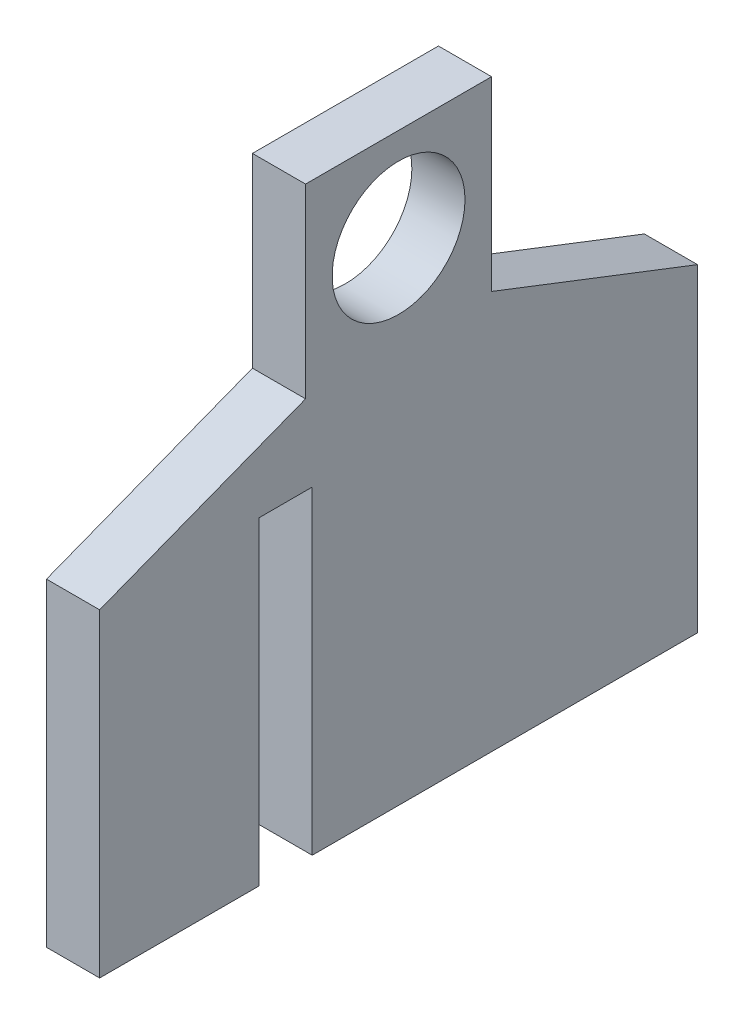
ISO-10303-21;
HEADER;
FILE_DESCRIPTION(('STEP AP214'),'2;1');
FILE_NAME('part.step','',(''),(''),'','','');
FILE_SCHEMA(('AUTOMOTIVE_DESIGN { 1 0 10303 214 1 1 1 1 }'));
ENDSEC;
DATA;
#1=APPLICATION_CONTEXT('core data for automotive mechanical design processes');
#2=APPLICATION_PROTOCOL_DEFINITION('international standard','automotive_design',2000,#1);
#3=PRODUCT_CONTEXT('',#1,'mechanical');
#4=PRODUCT('Part','Part','',(#3));
#5=PRODUCT_RELATED_PRODUCT_CATEGORY('part','',(#4));
#6=PRODUCT_DEFINITION_FORMATION('','',#4);
#7=PRODUCT_DEFINITION_CONTEXT('part definition',#1,'design');
#8=PRODUCT_DEFINITION('design','',#6,#7);
#9=PRODUCT_DEFINITION_SHAPE('','',#8);
#10=(LENGTH_UNIT() NAMED_UNIT(*) SI_UNIT(.MILLI.,.METRE.));
#11=(NAMED_UNIT(*) PLANE_ANGLE_UNIT() SI_UNIT($,.RADIAN.));
#12=(NAMED_UNIT(*) SI_UNIT($,.STERADIAN.) SOLID_ANGLE_UNIT());
#13=UNCERTAINTY_MEASURE_WITH_UNIT(LENGTH_MEASURE(1.E-05),#10,'distance_accuracy_value','');
#14=(GEOMETRIC_REPRESENTATION_CONTEXT(3) GLOBAL_UNCERTAINTY_ASSIGNED_CONTEXT((#13)) GLOBAL_UNIT_ASSIGNED_CONTEXT((#10,
#11,#12)) REPRESENTATION_CONTEXT('',''));
#15=CARTESIAN_POINT('',(0.,0.,0.));
#16=DIRECTION('',(0.,0.,1.));
#17=DIRECTION('',(1.,0.,0.));
#18=AXIS2_PLACEMENT_3D('',#15,#16,#17);
#19=CARTESIAN_POINT('',(2.,0.,0.));
#20=DIRECTION('',(1.,0.,0.));
#21=DIRECTION('',(0.,0.,-1.));
#22=AXIS2_PLACEMENT_3D('',#19,#20,#21);
#23=PLANE('',#22);
#24=DIRECTION('',(0.,-1.,0.));
#25=VECTOR('',#24,1.);
#26=CARTESIAN_POINT('',(2.,12.,11.25));
#27=LINE('',#26,#25);
#28=CARTESIAN_POINT('',(2.,12.,11.25));
#29=VERTEX_POINT('',#28);
#30=CARTESIAN_POINT('',(2.,0.,11.25));
#31=VERTEX_POINT('',#30);
#32=EDGE_CURVE('E177',#29,#31,#27,.T.);
#33=ORIENTED_EDGE('',*,*,#32,.T.);
#34=DIRECTION('',(0.,0.,-1.));
#35=VECTOR('',#34,1.);
#36=CARTESIAN_POINT('',(2.,0.,11.25));
#37=LINE('',#36,#35);
#38=CARTESIAN_POINT('',(2.,0.,5.25));
#39=VERTEX_POINT('',#38);
#40=EDGE_CURVE('E105',#31,#39,#37,.T.);
#41=ORIENTED_EDGE('',*,*,#40,.T.);
#42=DIRECTION('',(0.,1.,0.));
#43=VECTOR('',#42,1.);
#44=CARTESIAN_POINT('',(2.,0.,5.25));
#45=LINE('',#44,#43);
#46=CARTESIAN_POINT('',(2.,12.,5.25));
#47=VERTEX_POINT('',#46);
#48=EDGE_CURVE('E204',#39,#47,#45,.T.);
#49=ORIENTED_EDGE('',*,*,#48,.T.);
#50=DIRECTION('',(0.,0.,-1.));
#51=VECTOR('',#50,1.);
#52=CARTESIAN_POINT('',(2.,12.,5.25));
#53=LINE('',#52,#51);
#54=CARTESIAN_POINT('',(2.,12.,3.25));
#55=VERTEX_POINT('',#54);
#56=EDGE_CURVE('E223',#47,#55,#53,.T.);
#57=ORIENTED_EDGE('',*,*,#56,.T.);
#58=DIRECTION('',(0.,-1.,0.));
#59=VECTOR('',#58,1.);
#60=CARTESIAN_POINT('',(2.,12.,3.25));
#61=LINE('',#60,#59);
#62=CARTESIAN_POINT('',(2.,0.,3.25));
#63=VERTEX_POINT('',#62);
#64=EDGE_CURVE('E220',#55,#63,#61,.T.);
#65=ORIENTED_EDGE('',*,*,#64,.T.);
#66=DIRECTION('',(0.,0.,-1.));
#67=VECTOR('',#66,1.);
#68=CARTESIAN_POINT('',(2.,0.,3.25));
#69=LINE('',#68,#67);
#70=CARTESIAN_POINT('',(2.,0.,-11.25));
#71=VERTEX_POINT('',#70);
#72=EDGE_CURVE('E222',#63,#71,#69,.T.);
#73=ORIENTED_EDGE('',*,*,#72,.T.);
#74=DIRECTION('',(0.,1.,0.));
#75=VECTOR('',#74,1.);
#76=CARTESIAN_POINT('',(2.,0.,-11.25));
#77=LINE('',#76,#75);
#78=CARTESIAN_POINT('',(2.,12.,-11.25));
#79=VERTEX_POINT('',#78);
#80=EDGE_CURVE('E225',#71,#79,#77,.T.);
#81=ORIENTED_EDGE('',*,*,#80,.T.);
#82=DIRECTION('',(0.,0.360994102557712,0.93256809827409));
#83=VECTOR('',#82,1.);
#84=CARTESIAN_POINT('',(2.,12.,-11.25));
#85=LINE('',#84,#83);
#86=CARTESIAN_POINT('',(2.,15.,-3.5));
#87=VERTEX_POINT('',#86);
#88=EDGE_CURVE('E231',#79,#87,#85,.T.);
#89=ORIENTED_EDGE('',*,*,#88,.T.);
#90=DIRECTION('',(0.,1.,0.));
#91=VECTOR('',#90,1.);
#92=CARTESIAN_POINT('',(2.,15.,-3.5));
#93=LINE('',#92,#91);
#94=CARTESIAN_POINT('',(2.,22.,-3.5));
#95=VERTEX_POINT('',#94);
#96=EDGE_CURVE('E136',#87,#95,#93,.T.);
#97=ORIENTED_EDGE('',*,*,#96,.T.);
#98=DIRECTION('',(0.,0.,1.));
#99=VECTOR('',#98,1.);
#100=CARTESIAN_POINT('',(2.,22.,-3.5));
#101=LINE('',#100,#99);
#102=CARTESIAN_POINT('',(2.,22.,3.5));
#103=VERTEX_POINT('',#102);
#104=EDGE_CURVE('E130',#95,#103,#101,.T.);
#105=ORIENTED_EDGE('',*,*,#104,.T.);
#106=DIRECTION('',(0.,-1.,0.));
#107=VECTOR('',#106,1.);
#108=CARTESIAN_POINT('',(2.,22.,3.5));
#109=LINE('',#108,#107);
#110=CARTESIAN_POINT('',(2.,15.,3.5));
#111=VERTEX_POINT('',#110);
#112=EDGE_CURVE('E134',#103,#111,#109,.T.);
#113=ORIENTED_EDGE('',*,*,#112,.T.);
#114=DIRECTION('',(0.,-0.360994102557712,0.93256809827409));
#115=VECTOR('',#114,1.);
#116=CARTESIAN_POINT('',(2.,15.,3.5));
#117=LINE('',#116,#115);
#118=EDGE_CURVE('E50',#111,#29,#117,.T.);
#119=ORIENTED_EDGE('',*,*,#118,.T.);
#120=EDGE_LOOP('',(#33,#41,#49,#57,#65,#73,#81,#89,#97,#105,#113,#119));
#121=FACE_BOUND('',#120,.T.);
#122=CARTESIAN_POINT('',(2.,18.5,0.));
#123=DIRECTION('',(1.,0.,0.));
#124=DIRECTION('',(0.,0.,-1.));
#125=AXIS2_PLACEMENT_3D('',#122,#123,#124);
#126=CIRCLE('',#125,2.5);
#127=CARTESIAN_POINT('',(2.,18.5,-2.5));
#128=VERTEX_POINT('',#127);
#129=EDGE_CURVE('E158',#128,#128,#126,.T.);
#130=ORIENTED_EDGE('',*,*,#129,.F.);
#131=EDGE_LOOP('',(#130));
#132=FACE_BOUND('',#131,.T.);
#133=ADVANCED_FACE('F33',(#121,#132),#23,.T.);
#134=CARTESIAN_POINT('',(0.,0.,0.));
#135=DIRECTION('',(1.,0.,0.));
#136=DIRECTION('',(0.,0.,-1.));
#137=AXIS2_PLACEMENT_3D('',#134,#135,#136);
#138=PLANE('',#137);
#139=DIRECTION('',(0.,-1.,0.));
#140=VECTOR('',#139,1.);
#141=CARTESIAN_POINT('',(0.,12.,11.25));
#142=LINE('',#141,#140);
#143=CARTESIAN_POINT('',(0.,12.,11.25));
#144=VERTEX_POINT('',#143);
#145=CARTESIAN_POINT('',(0.,0.,11.25));
#146=VERTEX_POINT('',#145);
#147=EDGE_CURVE('E154',#144,#146,#142,.T.);
#148=ORIENTED_EDGE('',*,*,#147,.F.);
#149=DIRECTION('',(0.,-0.360994102557712,0.93256809827409));
#150=VECTOR('',#149,1.);
#151=CARTESIAN_POINT('',(0.,15.,3.5));
#152=LINE('',#151,#150);
#153=CARTESIAN_POINT('',(0.,15.,3.5));
#154=VERTEX_POINT('',#153);
#155=EDGE_CURVE('E97',#154,#144,#152,.T.);
#156=ORIENTED_EDGE('',*,*,#155,.F.);
#157=DIRECTION('',(0.,-1.,0.));
#158=VECTOR('',#157,1.);
#159=CARTESIAN_POINT('',(0.,22.,3.5));
#160=LINE('',#159,#158);
#161=CARTESIAN_POINT('',(0.,22.,3.5));
#162=VERTEX_POINT('',#161);
#163=EDGE_CURVE('E91',#162,#154,#160,.T.);
#164=ORIENTED_EDGE('',*,*,#163,.F.);
#165=DIRECTION('',(0.,0.,1.));
#166=VECTOR('',#165,1.);
#167=CARTESIAN_POINT('',(0.,22.,-3.5));
#168=LINE('',#167,#166);
#169=CARTESIAN_POINT('',(0.,22.,-3.5));
#170=VERTEX_POINT('',#169);
#171=EDGE_CURVE('E144',#170,#162,#168,.T.);
#172=ORIENTED_EDGE('',*,*,#171,.F.);
#173=DIRECTION('',(0.,1.,0.));
#174=VECTOR('',#173,1.);
#175=CARTESIAN_POINT('',(0.,15.,-3.5));
#176=LINE('',#175,#174);
#177=CARTESIAN_POINT('',(0.,15.,-3.5));
#178=VERTEX_POINT('',#177);
#179=EDGE_CURVE('E172',#178,#170,#176,.T.);
#180=ORIENTED_EDGE('',*,*,#179,.F.);
#181=DIRECTION('',(0.,0.360994102557712,0.93256809827409));
#182=VECTOR('',#181,1.);
#183=CARTESIAN_POINT('',(0.,12.,-11.25));
#184=LINE('',#183,#182);
#185=CARTESIAN_POINT('',(0.,12.,-11.25));
#186=VERTEX_POINT('',#185);
#187=EDGE_CURVE('E170',#186,#178,#184,.T.);
#188=ORIENTED_EDGE('',*,*,#187,.F.);
#189=DIRECTION('',(0.,1.,0.));
#190=VECTOR('',#189,1.);
#191=CARTESIAN_POINT('',(0.,0.,-11.25));
#192=LINE('',#191,#190);
#193=CARTESIAN_POINT('',(0.,0.,-11.25));
#194=VERTEX_POINT('',#193);
#195=EDGE_CURVE('E168',#194,#186,#192,.T.);
#196=ORIENTED_EDGE('',*,*,#195,.F.);
#197=DIRECTION('',(0.,0.,-1.));
#198=VECTOR('',#197,1.);
#199=CARTESIAN_POINT('',(0.,0.,3.25));
#200=LINE('',#199,#198);
#201=CARTESIAN_POINT('',(0.,0.,3.25));
#202=VERTEX_POINT('',#201);
#203=EDGE_CURVE('E166',#202,#194,#200,.T.);
#204=ORIENTED_EDGE('',*,*,#203,.F.);
#205=DIRECTION('',(0.,-1.,0.));
#206=VECTOR('',#205,1.);
#207=CARTESIAN_POINT('',(0.,12.,3.25));
#208=LINE('',#207,#206);
#209=CARTESIAN_POINT('',(0.,12.,3.25));
#210=VERTEX_POINT('',#209);
#211=EDGE_CURVE('E164',#210,#202,#208,.T.);
#212=ORIENTED_EDGE('',*,*,#211,.F.);
#213=DIRECTION('',(0.,0.,-1.));
#214=VECTOR('',#213,1.);
#215=CARTESIAN_POINT('',(0.,12.,5.25));
#216=LINE('',#215,#214);
#217=CARTESIAN_POINT('',(0.,12.,5.25));
#218=VERTEX_POINT('',#217);
#219=EDGE_CURVE('E162',#218,#210,#216,.T.);
#220=ORIENTED_EDGE('',*,*,#219,.F.);
#221=DIRECTION('',(0.,1.,0.));
#222=VECTOR('',#221,1.);
#223=CARTESIAN_POINT('',(0.,0.,5.25));
#224=LINE('',#223,#222);
#225=CARTESIAN_POINT('',(0.,0.,5.25));
#226=VERTEX_POINT('',#225);
#227=EDGE_CURVE('E160',#226,#218,#224,.T.);
#228=ORIENTED_EDGE('',*,*,#227,.F.);
#229=DIRECTION('',(0.,0.,-1.));
#230=VECTOR('',#229,1.);
#231=CARTESIAN_POINT('',(0.,0.,11.25));
#232=LINE('',#231,#230);
#233=EDGE_CURVE('E157',#146,#226,#232,.T.);
#234=ORIENTED_EDGE('',*,*,#233,.F.);
#235=EDGE_LOOP('',(#148,#156,#164,#172,#180,#188,#196,#204,#212,#220,#228,#234));
#236=FACE_BOUND('',#235,.T.);
#237=CARTESIAN_POINT('',(0.,18.5,0.));
#238=DIRECTION('',(1.,0.,0.));
#239=DIRECTION('',(0.,0.,-1.));
#240=AXIS2_PLACEMENT_3D('',#237,#238,#239);
#241=CIRCLE('',#240,2.5);
#242=CARTESIAN_POINT('',(0.,18.5,-2.5));
#243=VERTEX_POINT('',#242);
#244=EDGE_CURVE('E378',#243,#243,#241,.T.);
#245=ORIENTED_EDGE('',*,*,#244,.T.);
#246=EDGE_LOOP('',(#245));
#247=FACE_BOUND('',#246,.T.);
#248=ADVANCED_FACE('F208',(#236,#247),#138,.F.);
#249=CARTESIAN_POINT('',(2.,12.,11.25));
#250=DIRECTION('',(0.,0.,-1.));
#251=DIRECTION('',(0.,1.,0.));
#252=AXIS2_PLACEMENT_3D('',#249,#250,#251);
#253=PLANE('',#252);
#254=ORIENTED_EDGE('',*,*,#147,.T.);
#255=DIRECTION('',(-1.,0.,0.));
#256=VECTOR('',#255,1.);
#257=CARTESIAN_POINT('',(2.,0.,11.25));
#258=LINE('',#257,#256);
#259=EDGE_CURVE('E11',#31,#146,#258,.T.);
#260=ORIENTED_EDGE('',*,*,#259,.F.);
#261=ORIENTED_EDGE('',*,*,#32,.F.);
#262=DIRECTION('',(-1.,0.,0.));
#263=VECTOR('',#262,1.);
#264=CARTESIAN_POINT('',(2.,12.,11.25));
#265=LINE('',#264,#263);
#266=EDGE_CURVE('E150',#29,#144,#265,.T.);
#267=ORIENTED_EDGE('',*,*,#266,.T.);
#268=EDGE_LOOP('',(#254,#260,#261,#267));
#269=FACE_BOUND('',#268,.T.);
#270=ADVANCED_FACE('F35',(#269),#253,.F.);
#271=CARTESIAN_POINT('',(2.,0.,11.25));
#272=DIRECTION('',(0.,1.,0.));
#273=DIRECTION('',(0.,0.,1.));
#274=AXIS2_PLACEMENT_3D('',#271,#272,#273);
#275=PLANE('',#274);
#276=ORIENTED_EDGE('',*,*,#233,.T.);
#277=DIRECTION('',(-1.,0.,0.));
#278=VECTOR('',#277,1.);
#279=CARTESIAN_POINT('',(2.,0.,5.25));
#280=LINE('',#279,#278);
#281=EDGE_CURVE('E42',#39,#226,#280,.T.);
#282=ORIENTED_EDGE('',*,*,#281,.F.);
#283=ORIENTED_EDGE('',*,*,#40,.F.);
#284=ORIENTED_EDGE('',*,*,#259,.T.);
#285=EDGE_LOOP('',(#276,#282,#283,#284));
#286=FACE_BOUND('',#285,.T.);
#287=ADVANCED_FACE('F265',(#286),#275,.F.);
#288=CARTESIAN_POINT('',(2.,0.,5.25));
#289=DIRECTION('',(0.,0.,1.));
#290=DIRECTION('',(1.,0.,0.));
#291=AXIS2_PLACEMENT_3D('',#288,#289,#290);
#292=PLANE('',#291);
#293=ORIENTED_EDGE('',*,*,#227,.T.);
#294=DIRECTION('',(-1.,0.,0.));
#295=VECTOR('',#294,1.);
#296=CARTESIAN_POINT('',(2.,12.,5.25));
#297=LINE('',#296,#295);
#298=EDGE_CURVE('E196',#47,#218,#297,.T.);
#299=ORIENTED_EDGE('',*,*,#298,.F.);
#300=ORIENTED_EDGE('',*,*,#48,.F.);
#301=ORIENTED_EDGE('',*,*,#281,.T.);
#302=EDGE_LOOP('',(#293,#299,#300,#301));
#303=FACE_BOUND('',#302,.T.);
#304=ADVANCED_FACE('F202',(#303),#292,.F.);
#305=CARTESIAN_POINT('',(2.,12.,5.25));
#306=DIRECTION('',(0.,1.,0.));
#307=DIRECTION('',(0.,0.,1.));
#308=AXIS2_PLACEMENT_3D('',#305,#306,#307);
#309=PLANE('',#308);
#310=ORIENTED_EDGE('',*,*,#219,.T.);
#311=DIRECTION('',(-1.,0.,0.));
#312=VECTOR('',#311,1.);
#313=CARTESIAN_POINT('',(2.,12.,3.25));
#314=LINE('',#313,#312);
#315=EDGE_CURVE('E193',#55,#210,#314,.T.);
#316=ORIENTED_EDGE('',*,*,#315,.F.);
#317=ORIENTED_EDGE('',*,*,#56,.F.);
#318=ORIENTED_EDGE('',*,*,#298,.T.);
#319=EDGE_LOOP('',(#310,#316,#317,#318));
#320=FACE_BOUND('',#319,.T.);
#321=ADVANCED_FACE('F214',(#320),#309,.F.);
#322=CARTESIAN_POINT('',(2.,12.,3.25));
#323=DIRECTION('',(0.,0.,-1.));
#324=DIRECTION('',(0.,1.,0.));
#325=AXIS2_PLACEMENT_3D('',#322,#323,#324);
#326=PLANE('',#325);
#327=ORIENTED_EDGE('',*,*,#211,.T.);
#328=DIRECTION('',(-1.,0.,0.));
#329=VECTOR('',#328,1.);
#330=CARTESIAN_POINT('',(2.,0.,3.25));
#331=LINE('',#330,#329);
#332=EDGE_CURVE('E190',#63,#202,#331,.T.);
#333=ORIENTED_EDGE('',*,*,#332,.F.);
#334=ORIENTED_EDGE('',*,*,#64,.F.);
#335=ORIENTED_EDGE('',*,*,#315,.T.);
#336=EDGE_LOOP('',(#327,#333,#334,#335));
#337=FACE_BOUND('',#336,.T.);
#338=ADVANCED_FACE('F218',(#337),#326,.F.);
#339=CARTESIAN_POINT('',(2.,0.,3.25));
#340=DIRECTION('',(0.,1.,0.));
#341=DIRECTION('',(0.,0.,1.));
#342=AXIS2_PLACEMENT_3D('',#339,#340,#341);
#343=PLANE('',#342);
#344=ORIENTED_EDGE('',*,*,#203,.T.);
#345=DIRECTION('',(-1.,0.,0.));
#346=VECTOR('',#345,1.);
#347=CARTESIAN_POINT('',(2.,0.,-11.25));
#348=LINE('',#347,#346);
#349=EDGE_CURVE('E187',#71,#194,#348,.T.);
#350=ORIENTED_EDGE('',*,*,#349,.F.);
#351=ORIENTED_EDGE('',*,*,#72,.F.);
#352=ORIENTED_EDGE('',*,*,#332,.T.);
#353=EDGE_LOOP('',(#344,#350,#351,#352));
#354=FACE_BOUND('',#353,.T.);
#355=ADVANCED_FACE('F278',(#354),#343,.F.);
#356=CARTESIAN_POINT('',(2.,0.,-11.25));
#357=DIRECTION('',(0.,0.,1.));
#358=DIRECTION('',(0.,-1.,0.));
#359=AXIS2_PLACEMENT_3D('',#356,#357,#358);
#360=PLANE('',#359);
#361=ORIENTED_EDGE('',*,*,#195,.T.);
#362=DIRECTION('',(-1.,0.,0.));
#363=VECTOR('',#362,1.);
#364=CARTESIAN_POINT('',(2.,12.,-11.25));
#365=LINE('',#364,#363);
#366=EDGE_CURVE('E184',#79,#186,#365,.T.);
#367=ORIENTED_EDGE('',*,*,#366,.F.);
#368=ORIENTED_EDGE('',*,*,#80,.F.);
#369=ORIENTED_EDGE('',*,*,#349,.T.);
#370=EDGE_LOOP('',(#361,#367,#368,#369));
#371=FACE_BOUND('',#370,.T.);
#372=ADVANCED_FACE('F281',(#371),#360,.F.);
#373=CARTESIAN_POINT('',(2.,12.,-11.25));
#374=DIRECTION('',(0.,-0.93256809827409,0.360994102557712));
#375=DIRECTION('',(0.,-0.360994102557712,-0.93256809827409));
#376=AXIS2_PLACEMENT_3D('',#373,#374,#375);
#377=PLANE('',#376);
#378=ORIENTED_EDGE('',*,*,#187,.T.);
#379=DIRECTION('',(-1.,0.,0.));
#380=VECTOR('',#379,1.);
#381=CARTESIAN_POINT('',(2.,15.,-3.5));
#382=LINE('',#381,#380);
#383=EDGE_CURVE('E181',#87,#178,#382,.T.);
#384=ORIENTED_EDGE('',*,*,#383,.F.);
#385=ORIENTED_EDGE('',*,*,#88,.F.);
#386=ORIENTED_EDGE('',*,*,#366,.T.);
#387=EDGE_LOOP('',(#378,#384,#385,#386));
#388=FACE_BOUND('',#387,.T.);
#389=ADVANCED_FACE('F237',(#388),#377,.F.);
#390=CARTESIAN_POINT('',(2.,15.,-3.5));
#391=DIRECTION('',(0.,0.,1.));
#392=DIRECTION('',(0.,-1.,0.));
#393=AXIS2_PLACEMENT_3D('',#390,#391,#392);
#394=PLANE('',#393);
#395=ORIENTED_EDGE('',*,*,#179,.T.);
#396=DIRECTION('',(-1.,0.,0.));
#397=VECTOR('',#396,1.);
#398=CARTESIAN_POINT('',(2.,22.,-3.5));
#399=LINE('',#398,#397);
#400=EDGE_CURVE('E145',#95,#170,#399,.T.);
#401=ORIENTED_EDGE('',*,*,#400,.F.);
#402=ORIENTED_EDGE('',*,*,#96,.F.);
#403=ORIENTED_EDGE('',*,*,#383,.T.);
#404=EDGE_LOOP('',(#395,#401,#402,#403));
#405=FACE_BOUND('',#404,.T.);
#406=ADVANCED_FACE('F241',(#405),#394,.F.);
#407=CARTESIAN_POINT('',(2.,22.,-3.5));
#408=DIRECTION('',(0.,-1.,0.));
#409=DIRECTION('',(0.,0.,-1.));
#410=AXIS2_PLACEMENT_3D('',#407,#408,#409);
#411=PLANE('',#410);
#412=ORIENTED_EDGE('',*,*,#171,.T.);
#413=DIRECTION('',(-1.,0.,0.));
#414=VECTOR('',#413,1.);
#415=CARTESIAN_POINT('',(2.,22.,3.5));
#416=LINE('',#415,#414);
#417=EDGE_CURVE('E141',#103,#162,#416,.T.);
#418=ORIENTED_EDGE('',*,*,#417,.F.);
#419=ORIENTED_EDGE('',*,*,#104,.F.);
#420=ORIENTED_EDGE('',*,*,#400,.T.);
#421=EDGE_LOOP('',(#412,#418,#419,#420));
#422=FACE_BOUND('',#421,.T.);
#423=ADVANCED_FACE('F142',(#422),#411,.F.);
#424=CARTESIAN_POINT('',(2.,22.,3.5));
#425=DIRECTION('',(0.,0.,-1.));
#426=DIRECTION('',(0.,1.,0.));
#427=AXIS2_PLACEMENT_3D('',#424,#425,#426);
#428=PLANE('',#427);
#429=ORIENTED_EDGE('',*,*,#163,.T.);
#430=DIRECTION('',(-1.,0.,0.));
#431=VECTOR('',#430,1.);
#432=CARTESIAN_POINT('',(2.,15.,3.5));
#433=LINE('',#432,#431);
#434=EDGE_CURVE('E146',#111,#154,#433,.T.);
#435=ORIENTED_EDGE('',*,*,#434,.F.);
#436=ORIENTED_EDGE('',*,*,#112,.F.);
#437=ORIENTED_EDGE('',*,*,#417,.T.);
#438=EDGE_LOOP('',(#429,#435,#436,#437));
#439=FACE_BOUND('',#438,.T.);
#440=ADVANCED_FACE('F148',(#439),#428,.F.);
#441=CARTESIAN_POINT('',(2.,15.,3.5));
#442=DIRECTION('',(0.,-0.93256809827409,-0.360994102557712));
#443=DIRECTION('',(0.,0.360994102557712,-0.93256809827409));
#444=AXIS2_PLACEMENT_3D('',#441,#442,#443);
#445=PLANE('',#444);
#446=ORIENTED_EDGE('',*,*,#155,.T.);
#447=ORIENTED_EDGE('',*,*,#266,.F.);
#448=ORIENTED_EDGE('',*,*,#118,.F.);
#449=ORIENTED_EDGE('',*,*,#434,.T.);
#450=EDGE_LOOP('',(#446,#447,#448,#449));
#451=FACE_BOUND('',#450,.T.);
#452=ADVANCED_FACE('F245',(#451),#445,.F.);
#453=CARTESIAN_POINT('',(2.,18.5,0.));
#454=DIRECTION('',(-1.,0.,0.));
#455=DIRECTION('',(0.,0.,1.));
#456=AXIS2_PLACEMENT_3D('',#453,#454,#455);
#457=CYLINDRICAL_SURFACE('',#456,2.5);
#458=ORIENTED_EDGE('',*,*,#129,.T.);
#459=EDGE_LOOP('',(#458));
#460=FACE_BOUND('',#459,.T.);
#461=ORIENTED_EDGE('',*,*,#244,.F.);
#462=EDGE_LOOP('',(#461));
#463=FACE_BOUND('',#462,.T.);
#464=ADVANCED_FACE('F247',(#460,#463),#457,.F.);
#465=CLOSED_SHELL('',(#133,#248,#270,#287,#304,#321,#338,#355,#372,#389,#406,#423,#440,#452,#464));
#466=MANIFOLD_SOLID_BREP('B2',#465);
#467=ADVANCED_BREP_SHAPE_REPRESENTATION('',(#18,#466),#14);
#468=SHAPE_DEFINITION_REPRESENTATION(#9,#467);
ENDSEC;
END-ISO-10303-21;
